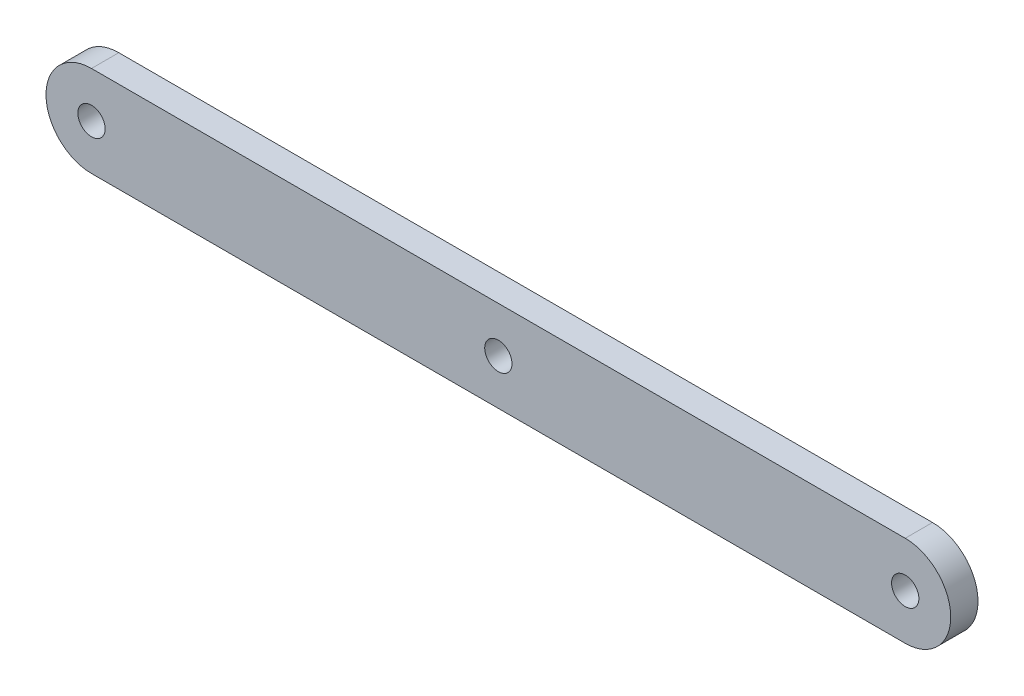
ISO-10303-21;
HEADER;
FILE_DESCRIPTION(('STEP AP214'),'2;1');
FILE_NAME('part.step','',(''),(''),'','','');
FILE_SCHEMA(('AUTOMOTIVE_DESIGN { 1 0 10303 214 1 1 1 1 }'));
ENDSEC;
DATA;
#1=APPLICATION_CONTEXT('core data for automotive mechanical design processes');
#2=APPLICATION_PROTOCOL_DEFINITION('international standard','automotive_design',2000,#1);
#3=PRODUCT_CONTEXT('',#1,'mechanical');
#4=PRODUCT('Part','Part','',(#3));
#5=PRODUCT_RELATED_PRODUCT_CATEGORY('part','',(#4));
#6=PRODUCT_DEFINITION_FORMATION('','',#4);
#7=PRODUCT_DEFINITION_CONTEXT('part definition',#1,'design');
#8=PRODUCT_DEFINITION('design','',#6,#7);
#9=PRODUCT_DEFINITION_SHAPE('','',#8);
#10=(LENGTH_UNIT() NAMED_UNIT(*) SI_UNIT(.MILLI.,.METRE.));
#11=(NAMED_UNIT(*) PLANE_ANGLE_UNIT() SI_UNIT($,.RADIAN.));
#12=(NAMED_UNIT(*) SI_UNIT($,.STERADIAN.) SOLID_ANGLE_UNIT());
#13=UNCERTAINTY_MEASURE_WITH_UNIT(LENGTH_MEASURE(1.E-05),#10,'distance_accuracy_value','');
#14=(GEOMETRIC_REPRESENTATION_CONTEXT(3) GLOBAL_UNCERTAINTY_ASSIGNED_CONTEXT((#13)) GLOBAL_UNIT_ASSIGNED_CONTEXT((#10,
#11,#12)) REPRESENTATION_CONTEXT('',''));
#15=CARTESIAN_POINT('',(0.,0.,0.));
#16=DIRECTION('',(0.,0.,1.));
#17=DIRECTION('',(1.,0.,0.));
#18=AXIS2_PLACEMENT_3D('',#15,#16,#17);
#19=CARTESIAN_POINT('',(-22.36,0.,0.75));
#20=DIRECTION('',(0.,0.,1.));
#21=DIRECTION('',(1.,0.,0.));
#22=AXIS2_PLACEMENT_3D('',#19,#20,#21);
#23=PLANE('',#22);
#24=CARTESIAN_POINT('',(-22.36,0.,0.75));
#25=DIRECTION('',(0.,0.,1.));
#26=DIRECTION('',(1.,0.,0.));
#27=AXIS2_PLACEMENT_3D('',#24,#25,#26);
#28=CIRCLE('',#27,0.750000000000002);
#29=CARTESIAN_POINT('',(-21.61,0.,0.75));
#30=VERTEX_POINT('',#29);
#31=EDGE_CURVE('E115',#30,#30,#28,.T.);
#32=ORIENTED_EDGE('',*,*,#31,.F.);
#33=EDGE_LOOP('',(#32));
#34=FACE_BOUND('',#33,.T.);
#35=CARTESIAN_POINT('',(-22.36,0.,0.75));
#36=DIRECTION('',(0.,0.,1.));
#37=DIRECTION('',(1.,0.,0.));
#38=AXIS2_PLACEMENT_3D('',#35,#36,#37);
#39=CIRCLE('',#38,2.50000000000001);
#40=CARTESIAN_POINT('',(-22.36,2.50000000000001,0.75));
#41=VERTEX_POINT('',#40);
#42=CARTESIAN_POINT('',(-22.36,-2.50000000000001,0.75));
#43=VERTEX_POINT('',#42);
#44=EDGE_CURVE('E85',#41,#43,#39,.T.);
#45=ORIENTED_EDGE('',*,*,#44,.T.);
#46=DIRECTION('',(1.,0.,0.));
#47=VECTOR('',#46,1.);
#48=CARTESIAN_POINT('',(-22.36,-2.50000000000001,0.75));
#49=LINE('',#48,#47);
#50=CARTESIAN_POINT('',(22.36,-2.5,0.75));
#51=VERTEX_POINT('',#50);
#52=EDGE_CURVE('E80',#43,#51,#49,.T.);
#53=ORIENTED_EDGE('',*,*,#52,.T.);
#54=CARTESIAN_POINT('',(22.36,0.,0.75));
#55=DIRECTION('',(0.,0.,1.));
#56=DIRECTION('',(1.,0.,0.));
#57=AXIS2_PLACEMENT_3D('',#54,#55,#56);
#58=CIRCLE('',#57,2.50000000000001);
#59=CARTESIAN_POINT('',(22.36,2.50000000000002,0.75));
#60=VERTEX_POINT('',#59);
#61=EDGE_CURVE('E83',#51,#60,#58,.T.);
#62=ORIENTED_EDGE('',*,*,#61,.T.);
#63=DIRECTION('',(-1.,0.,0.));
#64=VECTOR('',#63,1.);
#65=CARTESIAN_POINT('',(-22.36,2.50000000000001,0.75));
#66=LINE('',#65,#64);
#67=EDGE_CURVE('E50',#60,#41,#66,.T.);
#68=ORIENTED_EDGE('',*,*,#67,.T.);
#69=EDGE_LOOP('',(#45,#53,#62,#68));
#70=FACE_BOUND('',#69,.T.);
#71=CARTESIAN_POINT('',(22.36,0.,0.75));
#72=DIRECTION('',(0.,0.,1.));
#73=DIRECTION('',(1.,0.,0.));
#74=AXIS2_PLACEMENT_3D('',#71,#72,#73);
#75=CIRCLE('',#74,0.750000000000002);
#76=CARTESIAN_POINT('',(23.11,0.,0.75));
#77=VERTEX_POINT('',#76);
#78=EDGE_CURVE('E100',#77,#77,#75,.T.);
#79=ORIENTED_EDGE('',*,*,#78,.F.);
#80=EDGE_LOOP('',(#79));
#81=FACE_BOUND('',#80,.T.);
#82=CARTESIAN_POINT('',(0.,0.,0.75));
#83=DIRECTION('',(0.,0.,1.));
#84=DIRECTION('',(1.,0.,0.));
#85=AXIS2_PLACEMENT_3D('',#82,#83,#84);
#86=CIRCLE('',#85,0.75);
#87=CARTESIAN_POINT('',(0.749999999999993,0.,0.75));
#88=VERTEX_POINT('',#87);
#89=EDGE_CURVE('E121',#88,#88,#86,.T.);
#90=ORIENTED_EDGE('',*,*,#89,.F.);
#91=EDGE_LOOP('',(#90));
#92=FACE_BOUND('',#91,.T.);
#93=ADVANCED_FACE('F33',(#34,#70,#81,#92),#23,.T.);
#94=CARTESIAN_POINT('',(-22.36,0.,-0.75));
#95=DIRECTION('',(0.,0.,1.));
#96=DIRECTION('',(1.,0.,0.));
#97=AXIS2_PLACEMENT_3D('',#94,#95,#96);
#98=PLANE('',#97);
#99=CARTESIAN_POINT('',(-22.36,0.,-0.75));
#100=DIRECTION('',(0.,0.,1.));
#101=DIRECTION('',(1.,0.,0.));
#102=AXIS2_PLACEMENT_3D('',#99,#100,#101);
#103=CIRCLE('',#102,2.50000000000001);
#104=CARTESIAN_POINT('',(-22.36,2.50000000000001,-0.75));
#105=VERTEX_POINT('',#104);
#106=CARTESIAN_POINT('',(-22.36,-2.50000000000001,-0.75));
#107=VERTEX_POINT('',#106);
#108=EDGE_CURVE('E97',#105,#107,#103,.T.);
#109=ORIENTED_EDGE('',*,*,#108,.F.);
#110=DIRECTION('',(-1.,0.,0.));
#111=VECTOR('',#110,1.);
#112=CARTESIAN_POINT('',(-22.36,2.50000000000001,-0.75));
#113=LINE('',#112,#111);
#114=CARTESIAN_POINT('',(22.36,2.50000000000002,-0.75));
#115=VERTEX_POINT('',#114);
#116=EDGE_CURVE('E73',#115,#105,#113,.T.);
#117=ORIENTED_EDGE('',*,*,#116,.F.);
#118=CARTESIAN_POINT('',(22.36,0.,-0.75));
#119=DIRECTION('',(0.,0.,1.));
#120=DIRECTION('',(1.,0.,0.));
#121=AXIS2_PLACEMENT_3D('',#118,#119,#120);
#122=CIRCLE('',#121,2.50000000000001);
#123=CARTESIAN_POINT('',(22.36,-2.5,-0.75));
#124=VERTEX_POINT('',#123);
#125=EDGE_CURVE('E67',#124,#115,#122,.T.);
#126=ORIENTED_EDGE('',*,*,#125,.F.);
#127=DIRECTION('',(1.,0.,0.));
#128=VECTOR('',#127,1.);
#129=CARTESIAN_POINT('',(-22.36,-2.50000000000001,-0.75));
#130=LINE('',#129,#128);
#131=EDGE_CURVE('E89',#107,#124,#130,.T.);
#132=ORIENTED_EDGE('',*,*,#131,.F.);
#133=EDGE_LOOP('',(#109,#117,#126,#132));
#134=FACE_BOUND('',#133,.T.);
#135=CARTESIAN_POINT('',(22.36,0.,-0.75));
#136=DIRECTION('',(0.,0.,1.));
#137=DIRECTION('',(1.,0.,0.));
#138=AXIS2_PLACEMENT_3D('',#135,#136,#137);
#139=CIRCLE('',#138,0.750000000000002);
#140=CARTESIAN_POINT('',(23.11,0.,-0.75));
#141=VERTEX_POINT('',#140);
#142=EDGE_CURVE('E112',#141,#141,#139,.T.);
#143=ORIENTED_EDGE('',*,*,#142,.T.);
#144=EDGE_LOOP('',(#143));
#145=FACE_BOUND('',#144,.T.);
#146=CARTESIAN_POINT('',(-22.36,0.,-0.75));
#147=DIRECTION('',(0.,0.,1.));
#148=DIRECTION('',(1.,0.,0.));
#149=AXIS2_PLACEMENT_3D('',#146,#147,#148);
#150=CIRCLE('',#149,0.750000000000002);
#151=CARTESIAN_POINT('',(-21.61,0.,-0.75));
#152=VERTEX_POINT('',#151);
#153=EDGE_CURVE('E118',#152,#152,#150,.T.);
#154=ORIENTED_EDGE('',*,*,#153,.T.);
#155=EDGE_LOOP('',(#154));
#156=FACE_BOUND('',#155,.T.);
#157=CARTESIAN_POINT('',(0.,0.,-0.75));
#158=DIRECTION('',(0.,0.,1.));
#159=DIRECTION('',(1.,0.,0.));
#160=AXIS2_PLACEMENT_3D('',#157,#158,#159);
#161=CIRCLE('',#160,0.75);
#162=CARTESIAN_POINT('',(0.749999999999993,0.,-0.75));
#163=VERTEX_POINT('',#162);
#164=EDGE_CURVE('E124',#163,#163,#161,.T.);
#165=ORIENTED_EDGE('',*,*,#164,.T.);
#166=EDGE_LOOP('',(#165));
#167=FACE_BOUND('',#166,.T.);
#168=ADVANCED_FACE('F108',(#134,#145,#156,#167),#98,.F.);
#169=CARTESIAN_POINT('',(-22.36,0.,0.75));
#170=DIRECTION('',(0.,0.,-1.));
#171=DIRECTION('',(-1.,0.,0.));
#172=AXIS2_PLACEMENT_3D('',#169,#170,#171);
#173=CYLINDRICAL_SURFACE('',#172,2.50000000000001);
#174=ORIENTED_EDGE('',*,*,#108,.T.);
#175=DIRECTION('',(0.,0.,-1.));
#176=VECTOR('',#175,1.);
#177=CARTESIAN_POINT('',(-22.36,-2.50000000000001,0.75));
#178=LINE('',#177,#176);
#179=EDGE_CURVE('E11',#43,#107,#178,.T.);
#180=ORIENTED_EDGE('',*,*,#179,.F.);
#181=ORIENTED_EDGE('',*,*,#44,.F.);
#182=DIRECTION('',(0.,0.,-1.));
#183=VECTOR('',#182,1.);
#184=CARTESIAN_POINT('',(-22.36,2.50000000000001,0.75));
#185=LINE('',#184,#183);
#186=EDGE_CURVE('E93',#41,#105,#185,.T.);
#187=ORIENTED_EDGE('',*,*,#186,.T.);
#188=EDGE_LOOP('',(#174,#180,#181,#187));
#189=FACE_BOUND('',#188,.T.);
#190=ADVANCED_FACE('F35',(#189),#173,.T.);
#191=CARTESIAN_POINT('',(-22.36,-2.50000000000001,0.75));
#192=DIRECTION('',(0.,1.,0.));
#193=DIRECTION('',(-1.,0.,0.));
#194=AXIS2_PLACEMENT_3D('',#191,#192,#193);
#195=PLANE('',#194);
#196=ORIENTED_EDGE('',*,*,#131,.T.);
#197=DIRECTION('',(0.,0.,-1.));
#198=VECTOR('',#197,1.);
#199=CARTESIAN_POINT('',(22.36,-2.5,0.75));
#200=LINE('',#199,#198);
#201=EDGE_CURVE('E42',#51,#124,#200,.T.);
#202=ORIENTED_EDGE('',*,*,#201,.F.);
#203=ORIENTED_EDGE('',*,*,#52,.F.);
#204=ORIENTED_EDGE('',*,*,#179,.T.);
#205=EDGE_LOOP('',(#196,#202,#203,#204));
#206=FACE_BOUND('',#205,.T.);
#207=ADVANCED_FACE('F88',(#206),#195,.F.);
#208=CARTESIAN_POINT('',(22.36,0.,0.75));
#209=DIRECTION('',(0.,0.,-1.));
#210=DIRECTION('',(-1.,0.,0.));
#211=AXIS2_PLACEMENT_3D('',#208,#209,#210);
#212=CYLINDRICAL_SURFACE('',#211,2.50000000000001);
#213=ORIENTED_EDGE('',*,*,#125,.T.);
#214=DIRECTION('',(0.,0.,-1.));
#215=VECTOR('',#214,1.);
#216=CARTESIAN_POINT('',(22.36,2.50000000000002,0.75));
#217=LINE('',#216,#215);
#218=EDGE_CURVE('E90',#60,#115,#217,.T.);
#219=ORIENTED_EDGE('',*,*,#218,.F.);
#220=ORIENTED_EDGE('',*,*,#61,.F.);
#221=ORIENTED_EDGE('',*,*,#201,.T.);
#222=EDGE_LOOP('',(#213,#219,#220,#221));
#223=FACE_BOUND('',#222,.T.);
#224=ADVANCED_FACE('F91',(#223),#212,.T.);
#225=CARTESIAN_POINT('',(-22.36,2.50000000000001,0.75));
#226=DIRECTION('',(0.,-1.,0.));
#227=DIRECTION('',(1.,0.,0.));
#228=AXIS2_PLACEMENT_3D('',#225,#226,#227);
#229=PLANE('',#228);
#230=ORIENTED_EDGE('',*,*,#116,.T.);
#231=ORIENTED_EDGE('',*,*,#186,.F.);
#232=ORIENTED_EDGE('',*,*,#67,.F.);
#233=ORIENTED_EDGE('',*,*,#218,.T.);
#234=EDGE_LOOP('',(#230,#231,#232,#233));
#235=FACE_BOUND('',#234,.T.);
#236=ADVANCED_FACE('F105',(#235),#229,.F.);
#237=CARTESIAN_POINT('',(22.36,0.,0.75));
#238=DIRECTION('',(0.,0.,-1.));
#239=DIRECTION('',(-1.,0.,0.));
#240=AXIS2_PLACEMENT_3D('',#237,#238,#239);
#241=CYLINDRICAL_SURFACE('',#240,0.750000000000002);
#242=ORIENTED_EDGE('',*,*,#78,.T.);
#243=EDGE_LOOP('',(#242));
#244=FACE_BOUND('',#243,.T.);
#245=ORIENTED_EDGE('',*,*,#142,.F.);
#246=EDGE_LOOP('',(#245));
#247=FACE_BOUND('',#246,.T.);
#248=ADVANCED_FACE('F142',(#244,#247),#241,.F.);
#249=CARTESIAN_POINT('',(-22.36,0.,0.75));
#250=DIRECTION('',(0.,0.,-1.));
#251=DIRECTION('',(-1.,0.,0.));
#252=AXIS2_PLACEMENT_3D('',#249,#250,#251);
#253=CYLINDRICAL_SURFACE('',#252,0.750000000000002);
#254=ORIENTED_EDGE('',*,*,#31,.T.);
#255=EDGE_LOOP('',(#254));
#256=FACE_BOUND('',#255,.T.);
#257=ORIENTED_EDGE('',*,*,#153,.F.);
#258=EDGE_LOOP('',(#257));
#259=FACE_BOUND('',#258,.T.);
#260=ADVANCED_FACE('F188',(#256,#259),#253,.F.);
#261=CARTESIAN_POINT('',(0.,0.,0.75));
#262=DIRECTION('',(0.,0.,-1.));
#263=DIRECTION('',(-1.,0.,0.));
#264=AXIS2_PLACEMENT_3D('',#261,#262,#263);
#265=CYLINDRICAL_SURFACE('',#264,0.75);
#266=ORIENTED_EDGE('',*,*,#89,.T.);
#267=EDGE_LOOP('',(#266));
#268=FACE_BOUND('',#267,.T.);
#269=ORIENTED_EDGE('',*,*,#164,.F.);
#270=EDGE_LOOP('',(#269));
#271=FACE_BOUND('',#270,.T.);
#272=ADVANCED_FACE('F130',(#268,#271),#265,.F.);
#273=CLOSED_SHELL('',(#93,#168,#190,#207,#224,#236,#248,#260,#272));
#274=MANIFOLD_SOLID_BREP('B2',#273);
#275=ADVANCED_BREP_SHAPE_REPRESENTATION('',(#18,#274),#14);
#276=SHAPE_DEFINITION_REPRESENTATION(#9,#275);
ENDSEC;
END-ISO-10303-21;
